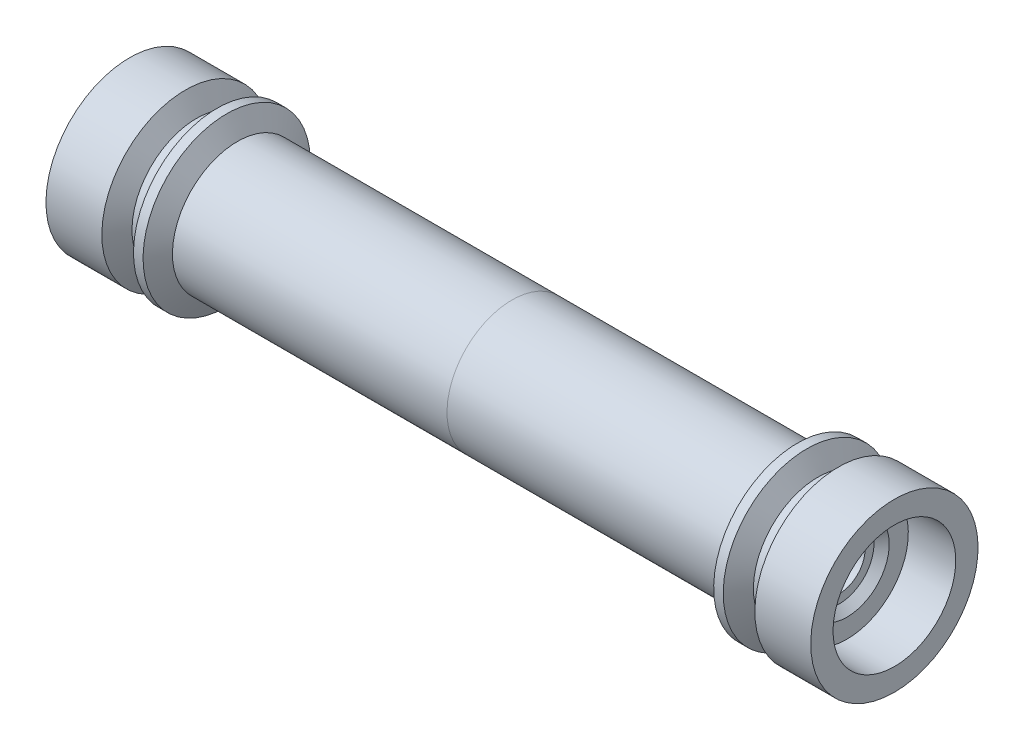
ISO-10303-21;
HEADER;
FILE_DESCRIPTION(('STEP AP214'),'2;1');
FILE_NAME('part.step','',(''),(''),'','','');
FILE_SCHEMA(('AUTOMOTIVE_DESIGN { 1 0 10303 214 1 1 1 1 }'));
ENDSEC;
DATA;
#1=APPLICATION_CONTEXT('core data for automotive mechanical design processes');
#2=APPLICATION_PROTOCOL_DEFINITION('international standard','automotive_design',2000,#1);
#3=PRODUCT_CONTEXT('',#1,'mechanical');
#4=PRODUCT('Part','Part','',(#3));
#5=PRODUCT_RELATED_PRODUCT_CATEGORY('part','',(#4));
#6=PRODUCT_DEFINITION_FORMATION('','',#4);
#7=PRODUCT_DEFINITION_CONTEXT('part definition',#1,'design');
#8=PRODUCT_DEFINITION('design','',#6,#7);
#9=PRODUCT_DEFINITION_SHAPE('','',#8);
#10=(LENGTH_UNIT() NAMED_UNIT(*) SI_UNIT(.MILLI.,.METRE.));
#11=(NAMED_UNIT(*) PLANE_ANGLE_UNIT() SI_UNIT($,.RADIAN.));
#12=(NAMED_UNIT(*) SI_UNIT($,.STERADIAN.) SOLID_ANGLE_UNIT());
#13=UNCERTAINTY_MEASURE_WITH_UNIT(LENGTH_MEASURE(1.E-05),#10,'distance_accuracy_value','');
#14=(GEOMETRIC_REPRESENTATION_CONTEXT(3) GLOBAL_UNCERTAINTY_ASSIGNED_CONTEXT((#13)) GLOBAL_UNIT_ASSIGNED_CONTEXT((#10,
#11,#12)) REPRESENTATION_CONTEXT('',''));
#15=CARTESIAN_POINT('',(0.,0.,0.));
#16=DIRECTION('',(0.,0.,1.));
#17=DIRECTION('',(1.,0.,0.));
#18=AXIS2_PLACEMENT_3D('',#15,#16,#17);
#19=CARTESIAN_POINT('',(-18.9517651581292,0.,0.));
#20=DIRECTION('',(-1.,0.,0.));
#21=DIRECTION('',(0.,-1.,0.));
#22=AXIS2_PLACEMENT_3D('',#19,#20,#21);
#23=CONICAL_SURFACE('',#22,5.55625,1.0471975511966);
#24=CARTESIAN_POINT('',(-18.2368611873051,0.,0.));
#25=DIRECTION('',(1.,0.,0.));
#26=DIRECTION('',(0.,-1.,0.));
#27=AXIS2_PLACEMENT_3D('',#24,#25,#26);
#28=CIRCLE('',#27,4.318);
#29=CARTESIAN_POINT('',(-18.2368611873051,-4.318,0.));
#30=VERTEX_POINT('',#29);
#31=EDGE_CURVE('E309',#30,#30,#28,.T.);
#32=ORIENTED_EDGE('',*,*,#31,.F.);
#33=EDGE_LOOP('',(#32));
#34=FACE_BOUND('',#33,.T.);
#35=CARTESIAN_POINT('',(-18.9517651581292,0.,0.));
#36=DIRECTION('',(1.,0.,0.));
#37=DIRECTION('',(0.,-1.,0.));
#38=AXIS2_PLACEMENT_3D('',#35,#36,#37);
#39=CIRCLE('',#38,5.55625);
#40=CARTESIAN_POINT('',(-18.9517651581292,-5.55625,0.));
#41=VERTEX_POINT('',#40);
#42=EDGE_CURVE('E112',#41,#41,#39,.T.);
#43=ORIENTED_EDGE('',*,*,#42,.T.);
#44=EDGE_LOOP('',(#43));
#45=FACE_BOUND('',#44,.T.);
#46=ADVANCED_FACE('F55',(#34,#45),#23,.T.);
#47=CARTESIAN_POINT('',(-25.4,0.,0.));
#48=DIRECTION('',(-1.,0.,0.));
#49=DIRECTION('',(0.,-1.,0.));
#50=AXIS2_PLACEMENT_3D('',#47,#48,#49);
#51=CYLINDRICAL_SURFACE('',#50,5.55625);
#52=ORIENTED_EDGE('',*,*,#42,.F.);
#53=EDGE_LOOP('',(#52));
#54=FACE_BOUND('',#53,.T.);
#55=CARTESIAN_POINT('',(-19.5867651581292,0.,0.));
#56=DIRECTION('',(1.,0.,0.));
#57=DIRECTION('',(0.,-1.,0.));
#58=AXIS2_PLACEMENT_3D('',#55,#56,#57);
#59=CIRCLE('',#58,5.55625);
#60=CARTESIAN_POINT('',(-19.5867651581292,-5.55625,0.));
#61=VERTEX_POINT('',#60);
#62=EDGE_CURVE('E109',#61,#61,#59,.T.);
#63=ORIENTED_EDGE('',*,*,#62,.T.);
#64=EDGE_LOOP('',(#63));
#65=FACE_BOUND('',#64,.T.);
#66=ADVANCED_FACE('F137',(#54,#65),#51,.T.);
#67=CARTESIAN_POINT('',(-20.32,0.,0.));
#68=DIRECTION('',(1.,0.,0.));
#69=DIRECTION('',(0.,1.,0.));
#70=AXIS2_PLACEMENT_3D('',#67,#68,#69);
#71=CONICAL_SURFACE('',#70,4.28625,1.0471975511966);
#72=ORIENTED_EDGE('',*,*,#62,.F.);
#73=EDGE_LOOP('',(#72));
#74=FACE_BOUND('',#73,.T.);
#75=CARTESIAN_POINT('',(-20.32,0.,0.));
#76=DIRECTION('',(1.,0.,0.));
#77=DIRECTION('',(0.,-1.,0.));
#78=AXIS2_PLACEMENT_3D('',#75,#76,#77);
#79=CIRCLE('',#78,4.28625);
#80=CARTESIAN_POINT('',(-20.32,-4.28625,0.));
#81=VERTEX_POINT('',#80);
#82=EDGE_CURVE('E106',#81,#81,#79,.T.);
#83=ORIENTED_EDGE('',*,*,#82,.T.);
#84=EDGE_LOOP('',(#83));
#85=FACE_BOUND('',#84,.T.);
#86=ADVANCED_FACE('F142',(#74,#85),#71,.T.);
#87=CARTESIAN_POINT('',(-25.4,0.,0.));
#88=DIRECTION('',(-1.,0.,0.));
#89=DIRECTION('',(0.,-1.,0.));
#90=AXIS2_PLACEMENT_3D('',#87,#88,#89);
#91=CYLINDRICAL_SURFACE('',#90,4.28625);
#92=ORIENTED_EDGE('',*,*,#82,.F.);
#93=EDGE_LOOP('',(#92));
#94=FACE_BOUND('',#93,.T.);
#95=CARTESIAN_POINT('',(-20.955,0.,0.));
#96=DIRECTION('',(1.,0.,0.));
#97=DIRECTION('',(0.,-1.,0.));
#98=AXIS2_PLACEMENT_3D('',#95,#96,#97);
#99=CIRCLE('',#98,4.28625);
#100=CARTESIAN_POINT('',(-20.955,-4.28625,0.));
#101=VERTEX_POINT('',#100);
#102=EDGE_CURVE('E103',#101,#101,#99,.T.);
#103=ORIENTED_EDGE('',*,*,#102,.T.);
#104=EDGE_LOOP('',(#103));
#105=FACE_BOUND('',#104,.T.);
#106=ADVANCED_FACE('F150',(#94,#105),#91,.T.);
#107=CARTESIAN_POINT('',(-21.6882348418708,0.,0.));
#108=DIRECTION('',(-1.,0.,0.));
#109=DIRECTION('',(0.,-1.,0.));
#110=AXIS2_PLACEMENT_3D('',#107,#108,#109);
#111=CONICAL_SURFACE('',#110,5.55625,1.0471975511966);
#112=ORIENTED_EDGE('',*,*,#102,.F.);
#113=EDGE_LOOP('',(#112));
#114=FACE_BOUND('',#113,.T.);
#115=CARTESIAN_POINT('',(-21.6882348418708,0.,0.));
#116=DIRECTION('',(1.,0.,0.));
#117=DIRECTION('',(0.,-1.,0.));
#118=AXIS2_PLACEMENT_3D('',#115,#116,#117);
#119=CIRCLE('',#118,5.55625);
#120=CARTESIAN_POINT('',(-21.6882348418708,-5.55625,0.));
#121=VERTEX_POINT('',#120);
#122=EDGE_CURVE('E100',#121,#121,#119,.T.);
#123=ORIENTED_EDGE('',*,*,#122,.T.);
#124=EDGE_LOOP('',(#123));
#125=FACE_BOUND('',#124,.T.);
#126=ADVANCED_FACE('F154',(#114,#125),#111,.T.);
#127=CARTESIAN_POINT('',(-25.4,0.,0.));
#128=DIRECTION('',(-1.,0.,0.));
#129=DIRECTION('',(0.,-1.,0.));
#130=AXIS2_PLACEMENT_3D('',#127,#128,#129);
#131=CYLINDRICAL_SURFACE('',#130,5.55625);
#132=ORIENTED_EDGE('',*,*,#122,.F.);
#133=EDGE_LOOP('',(#132));
#134=FACE_BOUND('',#133,.T.);
#135=CARTESIAN_POINT('',(-25.4,0.,0.));
#136=DIRECTION('',(1.,0.,0.));
#137=DIRECTION('',(0.,-1.,0.));
#138=AXIS2_PLACEMENT_3D('',#135,#136,#137);
#139=CIRCLE('',#138,5.55625);
#140=CARTESIAN_POINT('',(-25.4,-5.55625,0.));
#141=VERTEX_POINT('',#140);
#142=EDGE_CURVE('E97',#141,#141,#139,.T.);
#143=ORIENTED_EDGE('',*,*,#142,.T.);
#144=EDGE_LOOP('',(#143));
#145=FACE_BOUND('',#144,.T.);
#146=ADVANCED_FACE('F158',(#134,#145),#131,.T.);
#147=CARTESIAN_POINT('',(-25.4,0.,0.));
#148=DIRECTION('',(1.,0.,0.));
#149=DIRECTION('',(0.,1.,0.));
#150=AXIS2_PLACEMENT_3D('',#147,#148,#149);
#151=PLANE('',#150);
#152=CARTESIAN_POINT('',(-25.4,0.,0.));
#153=DIRECTION('',(-1.,0.,0.));
#154=DIRECTION('',(0.,1.,0.));
#155=AXIS2_PLACEMENT_3D('',#152,#153,#154);
#156=CIRCLE('',#155,4.583);
#157=CARTESIAN_POINT('',(-25.4,4.583,0.));
#158=VERTEX_POINT('',#157);
#159=EDGE_CURVE('E12',#158,#158,#156,.T.);
#160=ORIENTED_EDGE('',*,*,#159,.F.);
#161=EDGE_LOOP('',(#160));
#162=FACE_BOUND('',#161,.T.);
#163=ORIENTED_EDGE('',*,*,#142,.F.);
#164=EDGE_LOOP('',(#163));
#165=FACE_BOUND('',#164,.T.);
#166=ADVANCED_FACE('F122',(#162,#165),#151,.F.);
#167=CARTESIAN_POINT('',(-25.4,0.,0.));
#168=DIRECTION('',(-1.,0.,0.));
#169=DIRECTION('',(0.,-1.,0.));
#170=AXIS2_PLACEMENT_3D('',#167,#168,#169);
#171=CYLINDRICAL_SURFACE('',#170,4.075);
#172=CARTESIAN_POINT('',(-24.892,0.,0.));
#173=DIRECTION('',(-1.,0.,0.));
#174=DIRECTION('',(0.,1.,0.));
#175=AXIS2_PLACEMENT_3D('',#172,#173,#174);
#176=CIRCLE('',#175,4.075);
#177=CARTESIAN_POINT('',(-24.892,4.075,0.));
#178=VERTEX_POINT('',#177);
#179=EDGE_CURVE('E62',#178,#178,#176,.F.);
#180=ORIENTED_EDGE('',*,*,#179,.F.);
#181=EDGE_LOOP('',(#180));
#182=FACE_BOUND('',#181,.T.);
#183=CARTESIAN_POINT('',(-22.25,0.,0.));
#184=DIRECTION('',(1.,0.,0.));
#185=DIRECTION('',(0.,-1.,0.));
#186=AXIS2_PLACEMENT_3D('',#183,#184,#185);
#187=CIRCLE('',#186,4.075);
#188=CARTESIAN_POINT('',(-22.25,-4.075,0.));
#189=VERTEX_POINT('',#188);
#190=EDGE_CURVE('E94',#189,#189,#187,.T.);
#191=ORIENTED_EDGE('',*,*,#190,.T.);
#192=EDGE_LOOP('',(#191));
#193=FACE_BOUND('',#192,.T.);
#194=ADVANCED_FACE('F118',(#182,#193),#171,.F.);
#195=CARTESIAN_POINT('',(-22.25,0.,0.));
#196=DIRECTION('',(1.,0.,0.));
#197=DIRECTION('',(0.,1.,0.));
#198=AXIS2_PLACEMENT_3D('',#195,#196,#197);
#199=PLANE('',#198);
#200=CARTESIAN_POINT('',(-22.25,0.,0.));
#201=DIRECTION('',(1.,0.,0.));
#202=DIRECTION('',(0.,-1.,0.));
#203=AXIS2_PLACEMENT_3D('',#200,#201,#202);
#204=CIRCLE('',#203,2.805);
#205=CARTESIAN_POINT('',(-22.25,-2.805,0.));
#206=VERTEX_POINT('',#205);
#207=EDGE_CURVE('E91',#206,#206,#204,.T.);
#208=ORIENTED_EDGE('',*,*,#207,.T.);
#209=EDGE_LOOP('',(#208));
#210=FACE_BOUND('',#209,.T.);
#211=ORIENTED_EDGE('',*,*,#190,.F.);
#212=EDGE_LOOP('',(#211));
#213=FACE_BOUND('',#212,.T.);
#214=ADVANCED_FACE('F121',(#210,#213),#199,.F.);
#215=CARTESIAN_POINT('',(-22.25,0.,0.));
#216=DIRECTION('',(-1.,0.,0.));
#217=DIRECTION('',(0.,-1.,0.));
#218=AXIS2_PLACEMENT_3D('',#215,#216,#217);
#219=CONICAL_SURFACE('',#218,2.805,0.785398163397447);
#220=CARTESIAN_POINT('',(-21.742,0.,0.));
#221=DIRECTION('',(1.,0.,0.));
#222=DIRECTION('',(0.,-1.,0.));
#223=AXIS2_PLACEMENT_3D('',#220,#221,#222);
#224=CIRCLE('',#223,2.297);
#225=CARTESIAN_POINT('',(-21.742,-2.297,0.));
#226=VERTEX_POINT('',#225);
#227=EDGE_CURVE('E88',#226,#226,#224,.T.);
#228=ORIENTED_EDGE('',*,*,#227,.T.);
#229=EDGE_LOOP('',(#228));
#230=FACE_BOUND('',#229,.T.);
#231=ORIENTED_EDGE('',*,*,#207,.F.);
#232=EDGE_LOOP('',(#231));
#233=FACE_BOUND('',#232,.T.);
#234=ADVANCED_FACE('F127',(#230,#233),#219,.F.);
#235=CARTESIAN_POINT('',(-21.742,0.,0.));
#236=DIRECTION('',(1.,0.,0.));
#237=DIRECTION('',(0.,1.,0.));
#238=AXIS2_PLACEMENT_3D('',#235,#236,#237);
#239=PLANE('',#238);
#240=CARTESIAN_POINT('',(-21.742,0.,0.));
#241=DIRECTION('',(1.,0.,0.));
#242=DIRECTION('',(0.,-1.,0.));
#243=AXIS2_PLACEMENT_3D('',#240,#241,#242);
#244=CIRCLE('',#243,1.7145);
#245=CARTESIAN_POINT('',(-21.742,-1.7145,0.));
#246=VERTEX_POINT('',#245);
#247=EDGE_CURVE('E79',#246,#246,#244,.T.);
#248=ORIENTED_EDGE('',*,*,#247,.T.);
#249=EDGE_LOOP('',(#248));
#250=FACE_BOUND('',#249,.T.);
#251=ORIENTED_EDGE('',*,*,#227,.F.);
#252=EDGE_LOOP('',(#251));
#253=FACE_BOUND('',#252,.T.);
#254=ADVANCED_FACE('F133',(#250,#253),#239,.F.);
#255=CARTESIAN_POINT('',(-25.4,0.,0.));
#256=DIRECTION('',(-1.,0.,0.));
#257=DIRECTION('',(0.,-1.,0.));
#258=AXIS2_PLACEMENT_3D('',#255,#256,#257);
#259=CYLINDRICAL_SURFACE('',#258,1.7145);
#260=CARTESIAN_POINT('',(-15.575,0.,0.));
#261=DIRECTION('',(1.,0.,0.));
#262=DIRECTION('',(0.,-1.,0.));
#263=AXIS2_PLACEMENT_3D('',#260,#261,#262);
#264=CIRCLE('',#263,1.7145);
#265=CARTESIAN_POINT('',(-15.575,-1.7145,0.));
#266=VERTEX_POINT('',#265);
#267=EDGE_CURVE('E75',#266,#266,#264,.T.);
#268=ORIENTED_EDGE('',*,*,#267,.T.);
#269=EDGE_LOOP('',(#268));
#270=FACE_BOUND('',#269,.T.);
#271=ORIENTED_EDGE('',*,*,#247,.F.);
#272=EDGE_LOOP('',(#271));
#273=FACE_BOUND('',#272,.T.);
#274=ADVANCED_FACE('F192',(#270,#273),#259,.F.);
#275=CARTESIAN_POINT('',(-15.575,0.,0.));
#276=DIRECTION('',(1.,0.,0.));
#277=DIRECTION('',(0.,1.,0.));
#278=AXIS2_PLACEMENT_3D('',#275,#276,#277);
#279=PLANE('',#278);
#280=ORIENTED_EDGE('',*,*,#267,.F.);
#281=EDGE_LOOP('',(#280));
#282=FACE_BOUND('',#281,.T.);
#283=ADVANCED_FACE('F69',(#282),#279,.F.);
#284=CARTESIAN_POINT('',(-12.5,0.,0.));
#285=DIRECTION('',(1.,0.,0.));
#286=DIRECTION('',(0.,1.,0.));
#287=AXIS2_PLACEMENT_3D('',#284,#285,#286);
#288=CONICAL_SURFACE('',#287,1.6,0.78539816339745);
#289=CARTESIAN_POINT('',(-14.1,0.,0.));
#290=VERTEX_POINT('',#289);
#291=VERTEX_LOOP('',#290);
#292=FACE_BOUND('',#291,.T.);
#293=CARTESIAN_POINT('',(-12.5,0.,0.));
#294=DIRECTION('',(1.,0.,0.));
#295=DIRECTION('',(0.,-1.,0.));
#296=AXIS2_PLACEMENT_3D('',#293,#294,#295);
#297=CIRCLE('',#296,1.6);
#298=CARTESIAN_POINT('',(-12.5,-1.6,0.));
#299=VERTEX_POINT('',#298);
#300=EDGE_CURVE('E73',#299,#299,#297,.T.);
#301=ORIENTED_EDGE('',*,*,#300,.T.);
#302=EDGE_LOOP('',(#301));
#303=FACE_BOUND('',#302,.T.);
#304=ADVANCED_FACE('F65',(#292,#303),#288,.F.);
#305=CARTESIAN_POINT('',(-25.4,0.,0.));
#306=DIRECTION('',(-1.,0.,0.));
#307=DIRECTION('',(0.,-1.,0.));
#308=AXIS2_PLACEMENT_3D('',#305,#306,#307);
#309=CYLINDRICAL_SURFACE('',#308,1.6);
#310=ORIENTED_EDGE('',*,*,#300,.F.);
#311=EDGE_LOOP('',(#310));
#312=FACE_BOUND('',#311,.T.);
#313=CARTESIAN_POINT('',(0.,0.,0.));
#314=DIRECTION('',(1.,0.,0.));
#315=DIRECTION('',(0.,-1.,0.));
#316=AXIS2_PLACEMENT_3D('',#313,#314,#315);
#317=CIRCLE('',#316,1.6);
#318=CARTESIAN_POINT('',(0.,-1.6,0.));
#319=VERTEX_POINT('',#318);
#320=EDGE_CURVE('E76',#319,#319,#317,.T.);
#321=ORIENTED_EDGE('',*,*,#320,.T.);
#322=EDGE_LOOP('',(#321));
#323=FACE_BOUND('',#322,.T.);
#324=ADVANCED_FACE('F68',(#312,#323),#309,.F.);
#325=CARTESIAN_POINT('',(0.,0.,0.));
#326=DIRECTION('',(-1.,0.,0.));
#327=DIRECTION('',(0.,-1.,0.));
#328=AXIS2_PLACEMENT_3D('',#325,#326,#327);
#329=PLANE('',#328);
#330=CARTESIAN_POINT('',(0.,0.,0.));
#331=DIRECTION('',(1.,0.,0.));
#332=DIRECTION('',(0.,-1.,0.));
#333=AXIS2_PLACEMENT_3D('',#330,#331,#332);
#334=CIRCLE('',#333,4.318);
#335=CARTESIAN_POINT('',(0.,-4.318,0.));
#336=VERTEX_POINT('',#335);
#337=EDGE_CURVE('E82',#336,#336,#334,.T.);
#338=ORIENTED_EDGE('',*,*,#337,.T.);
#339=EDGE_LOOP('',(#338));
#340=FACE_BOUND('',#339,.T.);
#341=ORIENTED_EDGE('',*,*,#320,.F.);
#342=EDGE_LOOP('',(#341));
#343=FACE_BOUND('',#342,.T.);
#344=ADVANCED_FACE('F177',(#340,#343),#329,.F.);
#345=CARTESIAN_POINT('',(-25.4,0.,0.));
#346=DIRECTION('',(-1.,0.,0.));
#347=DIRECTION('',(0.,-1.,0.));
#348=AXIS2_PLACEMENT_3D('',#345,#346,#347);
#349=CYLINDRICAL_SURFACE('',#348,4.318);
#350=ORIENTED_EDGE('',*,*,#337,.F.);
#351=EDGE_LOOP('',(#350));
#352=FACE_BOUND('',#351,.T.);
#353=ORIENTED_EDGE('',*,*,#31,.T.);
#354=EDGE_LOOP('',(#353));
#355=FACE_BOUND('',#354,.T.);
#356=ADVANCED_FACE('F173',(#352,#355),#349,.T.);
#357=CARTESIAN_POINT('',(-24.892,0.,0.));
#358=DIRECTION('',(-1.,0.,0.));
#359=DIRECTION('',(0.,-1.,0.));
#360=AXIS2_PLACEMENT_3D('',#357,#358,#359);
#361=CONICAL_SURFACE('',#360,4.075,0.785398163397457);
#362=ORIENTED_EDGE('',*,*,#159,.T.);
#363=EDGE_LOOP('',(#362));
#364=FACE_BOUND('',#363,.T.);
#365=ORIENTED_EDGE('',*,*,#179,.T.);
#366=EDGE_LOOP('',(#365));
#367=FACE_BOUND('',#366,.T.);
#368=ADVANCED_FACE('F57',(#364,#367),#361,.F.);
#369=CLOSED_SHELL('',(#46,#66,#86,#106,#126,#146,#166,#194,#214,#234,#254,#274,#283,#304,#324,
#344,#356,#368));
#370=MANIFOLD_SOLID_BREP('B2',#369);
#371=CARTESIAN_POINT('',(18.9517651581292,0.,0.));
#372=DIRECTION('',(1.,0.,0.));
#373=DIRECTION('',(0.,-1.,0.));
#374=AXIS2_PLACEMENT_3D('',#371,#372,#373);
#375=CONICAL_SURFACE('',#374,5.55625,1.0471975511966);
#376=CARTESIAN_POINT('',(18.2368611873051,0.,0.));
#377=DIRECTION('',(1.,0.,0.));
#378=DIRECTION('',(0.,-1.,0.));
#379=AXIS2_PLACEMENT_3D('',#376,#377,#378);
#380=CIRCLE('',#379,4.318);
#381=CARTESIAN_POINT('',(18.2368611873051,-4.318,0.));
#382=VERTEX_POINT('',#381);
#383=EDGE_CURVE('E449',#382,#382,#380,.T.);
#384=ORIENTED_EDGE('',*,*,#383,.T.);
#385=EDGE_LOOP('',(#384));
#386=FACE_BOUND('',#385,.T.);
#387=CARTESIAN_POINT('',(18.9517651581292,0.,0.));
#388=DIRECTION('',(1.,0.,0.));
#389=DIRECTION('',(0.,-1.,0.));
#390=AXIS2_PLACEMENT_3D('',#387,#388,#389);
#391=CIRCLE('',#390,5.55625);
#392=CARTESIAN_POINT('',(18.9517651581292,-5.55625,0.));
#393=VERTEX_POINT('',#392);
#394=EDGE_CURVE('E53',#393,#393,#391,.T.);
#395=ORIENTED_EDGE('',*,*,#394,.F.);
#396=EDGE_LOOP('',(#395));
#397=FACE_BOUND('',#396,.T.);
#398=ADVANCED_FACE('F323',(#386,#397),#375,.T.);
#399=CARTESIAN_POINT('',(25.4,0.,0.));
#400=DIRECTION('',(1.,0.,0.));
#401=DIRECTION('',(0.,-1.,0.));
#402=AXIS2_PLACEMENT_3D('',#399,#400,#401);
#403=CYLINDRICAL_SURFACE('',#402,5.55625);
#404=ORIENTED_EDGE('',*,*,#394,.T.);
#405=EDGE_LOOP('',(#404));
#406=FACE_BOUND('',#405,.T.);
#407=CARTESIAN_POINT('',(19.5867651581292,0.,0.));
#408=DIRECTION('',(1.,0.,0.));
#409=DIRECTION('',(0.,-1.,0.));
#410=AXIS2_PLACEMENT_3D('',#407,#408,#409);
#411=CIRCLE('',#410,5.55625);
#412=CARTESIAN_POINT('',(19.5867651581292,-5.55625,0.));
#413=VERTEX_POINT('',#412);
#414=EDGE_CURVE('E329',#413,#413,#411,.T.);
#415=ORIENTED_EDGE('',*,*,#414,.F.);
#416=EDGE_LOOP('',(#415));
#417=FACE_BOUND('',#416,.T.);
#418=ADVANCED_FACE('F384',(#406,#417),#403,.T.);
#419=CARTESIAN_POINT('',(20.32,0.,0.));
#420=DIRECTION('',(-1.,0.,0.));
#421=DIRECTION('',(0.,1.,0.));
#422=AXIS2_PLACEMENT_3D('',#419,#420,#421);
#423=CONICAL_SURFACE('',#422,4.28625,1.0471975511966);
#424=ORIENTED_EDGE('',*,*,#414,.T.);
#425=EDGE_LOOP('',(#424));
#426=FACE_BOUND('',#425,.T.);
#427=CARTESIAN_POINT('',(20.32,0.,0.));
#428=DIRECTION('',(1.,0.,0.));
#429=DIRECTION('',(0.,-1.,0.));
#430=AXIS2_PLACEMENT_3D('',#427,#428,#429);
#431=CIRCLE('',#430,4.28625);
#432=CARTESIAN_POINT('',(20.32,-4.28625,0.));
#433=VERTEX_POINT('',#432);
#434=EDGE_CURVE('E376',#433,#433,#431,.T.);
#435=ORIENTED_EDGE('',*,*,#434,.F.);
#436=EDGE_LOOP('',(#435));
#437=FACE_BOUND('',#436,.T.);
#438=ADVANCED_FACE('F381',(#426,#437),#423,.T.);
#439=CARTESIAN_POINT('',(25.4,0.,0.));
#440=DIRECTION('',(1.,0.,0.));
#441=DIRECTION('',(0.,-1.,0.));
#442=AXIS2_PLACEMENT_3D('',#439,#440,#441);
#443=CYLINDRICAL_SURFACE('',#442,4.28625);
#444=ORIENTED_EDGE('',*,*,#434,.T.);
#445=EDGE_LOOP('',(#444));
#446=FACE_BOUND('',#445,.T.);
#447=CARTESIAN_POINT('',(20.955,0.,0.));
#448=DIRECTION('',(1.,0.,0.));
#449=DIRECTION('',(0.,-1.,0.));
#450=AXIS2_PLACEMENT_3D('',#447,#448,#449);
#451=CIRCLE('',#450,4.28625);
#452=CARTESIAN_POINT('',(20.955,-4.28625,0.));
#453=VERTEX_POINT('',#452);
#454=EDGE_CURVE('E373',#453,#453,#451,.T.);
#455=ORIENTED_EDGE('',*,*,#454,.F.);
#456=EDGE_LOOP('',(#455));
#457=FACE_BOUND('',#456,.T.);
#458=ADVANCED_FACE('F391',(#446,#457),#443,.T.);
#459=CARTESIAN_POINT('',(21.6882348418708,0.,0.));
#460=DIRECTION('',(1.,0.,0.));
#461=DIRECTION('',(0.,-1.,0.));
#462=AXIS2_PLACEMENT_3D('',#459,#460,#461);
#463=CONICAL_SURFACE('',#462,5.55625,1.0471975511966);
#464=ORIENTED_EDGE('',*,*,#454,.T.);
#465=EDGE_LOOP('',(#464));
#466=FACE_BOUND('',#465,.T.);
#467=CARTESIAN_POINT('',(21.6882348418708,0.,0.));
#468=DIRECTION('',(1.,0.,0.));
#469=DIRECTION('',(0.,-1.,0.));
#470=AXIS2_PLACEMENT_3D('',#467,#468,#469);
#471=CIRCLE('',#470,5.55625);
#472=CARTESIAN_POINT('',(21.6882348418708,-5.55625,0.));
#473=VERTEX_POINT('',#472);
#474=EDGE_CURVE('E370',#473,#473,#471,.T.);
#475=ORIENTED_EDGE('',*,*,#474,.F.);
#476=EDGE_LOOP('',(#475));
#477=FACE_BOUND('',#476,.T.);
#478=ADVANCED_FACE('F397',(#466,#477),#463,.T.);
#479=CARTESIAN_POINT('',(25.4,0.,0.));
#480=DIRECTION('',(1.,0.,0.));
#481=DIRECTION('',(0.,-1.,0.));
#482=AXIS2_PLACEMENT_3D('',#479,#480,#481);
#483=CYLINDRICAL_SURFACE('',#482,5.55625);
#484=ORIENTED_EDGE('',*,*,#474,.T.);
#485=EDGE_LOOP('',(#484));
#486=FACE_BOUND('',#485,.T.);
#487=CARTESIAN_POINT('',(25.4,0.,0.));
#488=DIRECTION('',(1.,0.,0.));
#489=DIRECTION('',(0.,-1.,0.));
#490=AXIS2_PLACEMENT_3D('',#487,#488,#489);
#491=CIRCLE('',#490,5.55625);
#492=CARTESIAN_POINT('',(25.4,-5.55625,0.));
#493=VERTEX_POINT('',#492);
#494=EDGE_CURVE('E367',#493,#493,#491,.T.);
#495=ORIENTED_EDGE('',*,*,#494,.F.);
#496=EDGE_LOOP('',(#495));
#497=FACE_BOUND('',#496,.T.);
#498=ADVANCED_FACE('F401',(#486,#497),#483,.T.);
#499=CARTESIAN_POINT('',(25.4,0.,0.));
#500=DIRECTION('',(-1.,0.,0.));
#501=DIRECTION('',(0.,1.,0.));
#502=AXIS2_PLACEMENT_3D('',#499,#500,#501);
#503=PLANE('',#502);
#504=CARTESIAN_POINT('',(25.4,0.,0.));
#505=DIRECTION('',(1.,0.,0.));
#506=DIRECTION('',(0.,-1.,0.));
#507=AXIS2_PLACEMENT_3D('',#504,#505,#506);
#508=CIRCLE('',#507,4.075);
#509=CARTESIAN_POINT('',(25.4,-4.075,0.));
#510=VERTEX_POINT('',#509);
#511=EDGE_CURVE('E364',#510,#510,#508,.T.);
#512=ORIENTED_EDGE('',*,*,#511,.F.);
#513=EDGE_LOOP('',(#512));
#514=FACE_BOUND('',#513,.T.);
#515=ORIENTED_EDGE('',*,*,#494,.T.);
#516=EDGE_LOOP('',(#515));
#517=FACE_BOUND('',#516,.T.);
#518=ADVANCED_FACE('F405',(#514,#517),#503,.F.);
#519=CARTESIAN_POINT('',(25.4,0.,0.));
#520=DIRECTION('',(1.,0.,0.));
#521=DIRECTION('',(0.,-1.,0.));
#522=AXIS2_PLACEMENT_3D('',#519,#520,#521);
#523=CYLINDRICAL_SURFACE('',#522,4.075);
#524=CARTESIAN_POINT('',(22.25,0.,0.));
#525=DIRECTION('',(1.,0.,0.));
#526=DIRECTION('',(0.,-1.,0.));
#527=AXIS2_PLACEMENT_3D('',#524,#525,#526);
#528=CIRCLE('',#527,4.075);
#529=CARTESIAN_POINT('',(22.25,-4.075,0.));
#530=VERTEX_POINT('',#529);
#531=EDGE_CURVE('E361',#530,#530,#528,.T.);
#532=ORIENTED_EDGE('',*,*,#531,.F.);
#533=EDGE_LOOP('',(#532));
#534=FACE_BOUND('',#533,.T.);
#535=ORIENTED_EDGE('',*,*,#511,.T.);
#536=EDGE_LOOP('',(#535));
#537=FACE_BOUND('',#536,.T.);
#538=ADVANCED_FACE('F409',(#534,#537),#523,.F.);
#539=CARTESIAN_POINT('',(22.25,0.,0.));
#540=DIRECTION('',(-1.,0.,0.));
#541=DIRECTION('',(0.,1.,0.));
#542=AXIS2_PLACEMENT_3D('',#539,#540,#541);
#543=PLANE('',#542);
#544=CARTESIAN_POINT('',(22.25,0.,0.));
#545=DIRECTION('',(1.,0.,0.));
#546=DIRECTION('',(0.,-1.,0.));
#547=AXIS2_PLACEMENT_3D('',#544,#545,#546);
#548=CIRCLE('',#547,2.805);
#549=CARTESIAN_POINT('',(22.25,-2.805,0.));
#550=VERTEX_POINT('',#549);
#551=EDGE_CURVE('E358',#550,#550,#548,.T.);
#552=ORIENTED_EDGE('',*,*,#551,.F.);
#553=EDGE_LOOP('',(#552));
#554=FACE_BOUND('',#553,.T.);
#555=ORIENTED_EDGE('',*,*,#531,.T.);
#556=EDGE_LOOP('',(#555));
#557=FACE_BOUND('',#556,.T.);
#558=ADVANCED_FACE('F413',(#554,#557),#543,.F.);
#559=CARTESIAN_POINT('',(22.25,0.,0.));
#560=DIRECTION('',(1.,0.,0.));
#561=DIRECTION('',(0.,-1.,0.));
#562=AXIS2_PLACEMENT_3D('',#559,#560,#561);
#563=CONICAL_SURFACE('',#562,2.805,0.785398163397447);
#564=CARTESIAN_POINT('',(21.742,0.,0.));
#565=DIRECTION('',(1.,0.,0.));
#566=DIRECTION('',(0.,-1.,0.));
#567=AXIS2_PLACEMENT_3D('',#564,#565,#566);
#568=CIRCLE('',#567,2.297);
#569=CARTESIAN_POINT('',(21.742,-2.297,0.));
#570=VERTEX_POINT('',#569);
#571=EDGE_CURVE('E355',#570,#570,#568,.T.);
#572=ORIENTED_EDGE('',*,*,#571,.F.);
#573=EDGE_LOOP('',(#572));
#574=FACE_BOUND('',#573,.T.);
#575=ORIENTED_EDGE('',*,*,#551,.T.);
#576=EDGE_LOOP('',(#575));
#577=FACE_BOUND('',#576,.T.);
#578=ADVANCED_FACE('F417',(#574,#577),#563,.F.);
#579=CARTESIAN_POINT('',(21.742,0.,0.));
#580=DIRECTION('',(-1.,0.,0.));
#581=DIRECTION('',(0.,1.,0.));
#582=AXIS2_PLACEMENT_3D('',#579,#580,#581);
#583=PLANE('',#582);
#584=CARTESIAN_POINT('',(21.742,0.,0.));
#585=DIRECTION('',(1.,0.,0.));
#586=DIRECTION('',(0.,-1.,0.));
#587=AXIS2_PLACEMENT_3D('',#584,#585,#586);
#588=CIRCLE('',#587,1.7145);
#589=CARTESIAN_POINT('',(21.742,-1.7145,0.));
#590=VERTEX_POINT('',#589);
#591=EDGE_CURVE('E346',#590,#590,#588,.T.);
#592=ORIENTED_EDGE('',*,*,#591,.F.);
#593=EDGE_LOOP('',(#592));
#594=FACE_BOUND('',#593,.T.);
#595=ORIENTED_EDGE('',*,*,#571,.T.);
#596=EDGE_LOOP('',(#595));
#597=FACE_BOUND('',#596,.T.);
#598=ADVANCED_FACE('F421',(#594,#597),#583,.F.);
#599=CARTESIAN_POINT('',(25.4,0.,0.));
#600=DIRECTION('',(1.,0.,0.));
#601=DIRECTION('',(0.,-1.,0.));
#602=AXIS2_PLACEMENT_3D('',#599,#600,#601);
#603=CYLINDRICAL_SURFACE('',#602,1.7145);
#604=CARTESIAN_POINT('',(15.575,0.,0.));
#605=DIRECTION('',(1.,0.,0.));
#606=DIRECTION('',(0.,-1.,0.));
#607=AXIS2_PLACEMENT_3D('',#604,#605,#606);
#608=CIRCLE('',#607,1.7145);
#609=CARTESIAN_POINT('',(15.575,-1.7145,0.));
#610=VERTEX_POINT('',#609);
#611=EDGE_CURVE('E342',#610,#610,#608,.T.);
#612=ORIENTED_EDGE('',*,*,#611,.F.);
#613=EDGE_LOOP('',(#612));
#614=FACE_BOUND('',#613,.T.);
#615=ORIENTED_EDGE('',*,*,#591,.T.);
#616=EDGE_LOOP('',(#615));
#617=FACE_BOUND('',#616,.T.);
#618=ADVANCED_FACE('F425',(#614,#617),#603,.F.);
#619=CARTESIAN_POINT('',(15.575,0.,0.));
#620=DIRECTION('',(-1.,0.,0.));
#621=DIRECTION('',(0.,1.,0.));
#622=AXIS2_PLACEMENT_3D('',#619,#620,#621);
#623=PLANE('',#622);
#624=ORIENTED_EDGE('',*,*,#611,.T.);
#625=EDGE_LOOP('',(#624));
#626=FACE_BOUND('',#625,.T.);
#627=ADVANCED_FACE('F336',(#626),#623,.F.);
#628=CARTESIAN_POINT('',(12.5,0.,0.));
#629=DIRECTION('',(-1.,0.,0.));
#630=DIRECTION('',(0.,1.,0.));
#631=AXIS2_PLACEMENT_3D('',#628,#629,#630);
#632=CONICAL_SURFACE('',#631,1.6,0.78539816339745);
#633=CARTESIAN_POINT('',(14.1,0.,0.));
#634=VERTEX_POINT('',#633);
#635=VERTEX_LOOP('',#634);
#636=FACE_BOUND('',#635,.T.);
#637=CARTESIAN_POINT('',(12.5,0.,0.));
#638=DIRECTION('',(1.,0.,0.));
#639=DIRECTION('',(0.,-1.,0.));
#640=AXIS2_PLACEMENT_3D('',#637,#638,#639);
#641=CIRCLE('',#640,1.6);
#642=CARTESIAN_POINT('',(12.5,-1.6,0.));
#643=VERTEX_POINT('',#642);
#644=EDGE_CURVE('E340',#643,#643,#641,.T.);
#645=ORIENTED_EDGE('',*,*,#644,.F.);
#646=EDGE_LOOP('',(#645));
#647=FACE_BOUND('',#646,.T.);
#648=ADVANCED_FACE('F332',(#636,#647),#632,.F.);
#649=CARTESIAN_POINT('',(25.4,0.,0.));
#650=DIRECTION('',(1.,0.,0.));
#651=DIRECTION('',(0.,-1.,0.));
#652=AXIS2_PLACEMENT_3D('',#649,#650,#651);
#653=CYLINDRICAL_SURFACE('',#652,1.6);
#654=ORIENTED_EDGE('',*,*,#644,.T.);
#655=EDGE_LOOP('',(#654));
#656=FACE_BOUND('',#655,.T.);
#657=CARTESIAN_POINT('',(0.,0.,0.));
#658=DIRECTION('',(1.,0.,0.));
#659=DIRECTION('',(0.,-1.,0.));
#660=AXIS2_PLACEMENT_3D('',#657,#658,#659);
#661=CIRCLE('',#660,1.6);
#662=CARTESIAN_POINT('',(0.,-1.6,0.));
#663=VERTEX_POINT('',#662);
#664=EDGE_CURVE('E343',#663,#663,#661,.T.);
#665=ORIENTED_EDGE('',*,*,#664,.F.);
#666=EDGE_LOOP('',(#665));
#667=FACE_BOUND('',#666,.T.);
#668=ADVANCED_FACE('F335',(#656,#667),#653,.F.);
#669=CARTESIAN_POINT('',(0.,0.,0.));
#670=DIRECTION('',(1.,0.,0.));
#671=DIRECTION('',(0.,-1.,0.));
#672=AXIS2_PLACEMENT_3D('',#669,#670,#671);
#673=PLANE('',#672);
#674=CARTESIAN_POINT('',(0.,0.,0.));
#675=DIRECTION('',(1.,0.,0.));
#676=DIRECTION('',(0.,-1.,0.));
#677=AXIS2_PLACEMENT_3D('',#674,#675,#676);
#678=CIRCLE('',#677,4.318);
#679=CARTESIAN_POINT('',(0.,-4.318,0.));
#680=VERTEX_POINT('',#679);
#681=EDGE_CURVE('E349',#680,#680,#678,.T.);
#682=ORIENTED_EDGE('',*,*,#681,.F.);
#683=EDGE_LOOP('',(#682));
#684=FACE_BOUND('',#683,.T.);
#685=ORIENTED_EDGE('',*,*,#664,.T.);
#686=EDGE_LOOP('',(#685));
#687=FACE_BOUND('',#686,.T.);
#688=ADVANCED_FACE('F435',(#684,#687),#673,.F.);
#689=CARTESIAN_POINT('',(25.4,0.,0.));
#690=DIRECTION('',(1.,0.,0.));
#691=DIRECTION('',(0.,-1.,0.));
#692=AXIS2_PLACEMENT_3D('',#689,#690,#691);
#693=CYLINDRICAL_SURFACE('',#692,4.318);
#694=ORIENTED_EDGE('',*,*,#681,.T.);
#695=EDGE_LOOP('',(#694));
#696=FACE_BOUND('',#695,.T.);
#697=ORIENTED_EDGE('',*,*,#383,.F.);
#698=EDGE_LOOP('',(#697));
#699=FACE_BOUND('',#698,.T.);
#700=ADVANCED_FACE('F438',(#696,#699),#693,.T.);
#701=CLOSED_SHELL('',(#398,#418,#438,#458,#478,#498,#518,#538,#558,#578,#598,#618,#627,#648,
#668,#688,#700));
#702=MANIFOLD_SOLID_BREP('B6',#701);
#703=ADVANCED_BREP_SHAPE_REPRESENTATION('',(#18,#370,#702),#14);
#704=SHAPE_DEFINITION_REPRESENTATION(#9,#703);
ENDSEC;
END-ISO-10303-21;
